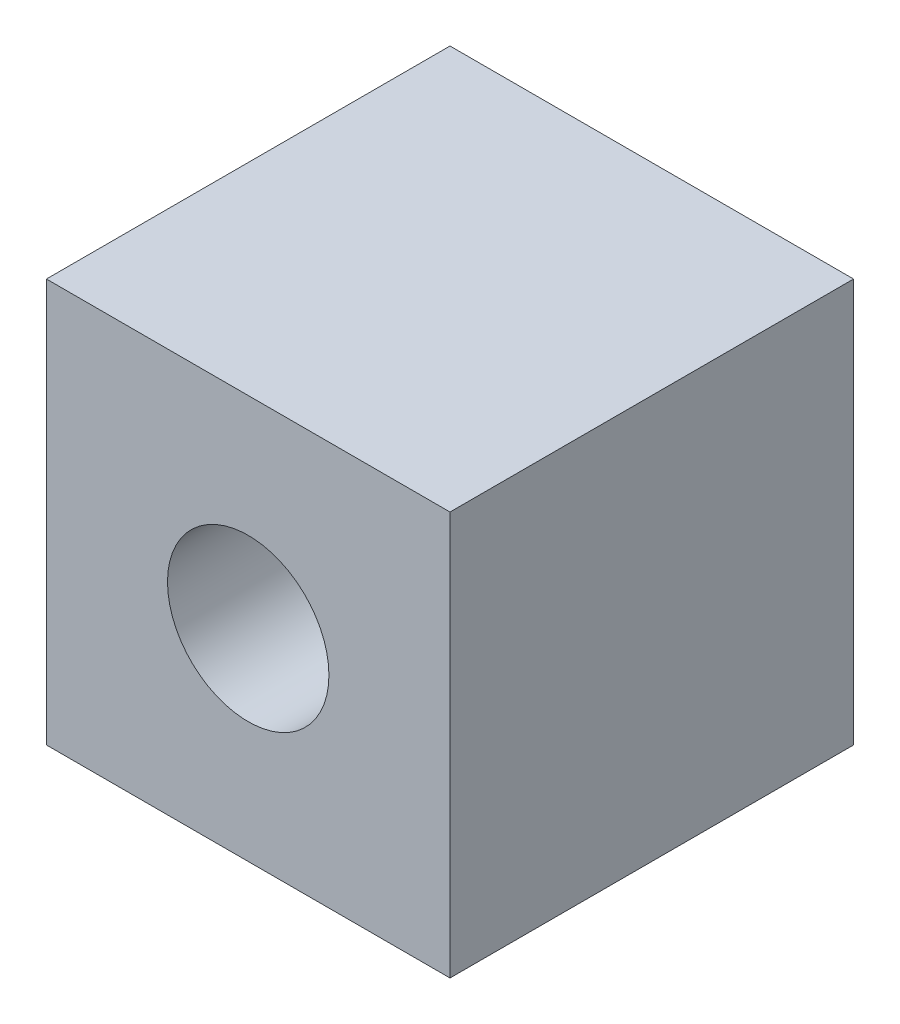
ISO-10303-21;
HEADER;
FILE_DESCRIPTION(('STEP AP214'),'2;1');
FILE_NAME('part.step','',(''),(''),'','','');
FILE_SCHEMA(('AUTOMOTIVE_DESIGN { 1 0 10303 214 1 1 1 1 }'));
ENDSEC;
DATA;
#1=APPLICATION_CONTEXT('core data for automotive mechanical design processes');
#2=APPLICATION_PROTOCOL_DEFINITION('international standard','automotive_design',2000,#1);
#3=PRODUCT_CONTEXT('',#1,'mechanical');
#4=PRODUCT('Part','Part','',(#3));
#5=PRODUCT_RELATED_PRODUCT_CATEGORY('part','',(#4));
#6=PRODUCT_DEFINITION_FORMATION('','',#4);
#7=PRODUCT_DEFINITION_CONTEXT('part definition',#1,'design');
#8=PRODUCT_DEFINITION('design','',#6,#7);
#9=PRODUCT_DEFINITION_SHAPE('','',#8);
#10=(LENGTH_UNIT() NAMED_UNIT(*) SI_UNIT(.MILLI.,.METRE.));
#11=(NAMED_UNIT(*) PLANE_ANGLE_UNIT() SI_UNIT($,.RADIAN.));
#12=(NAMED_UNIT(*) SI_UNIT($,.STERADIAN.) SOLID_ANGLE_UNIT());
#13=UNCERTAINTY_MEASURE_WITH_UNIT(LENGTH_MEASURE(1.E-05),#10,'distance_accuracy_value','');
#14=(GEOMETRIC_REPRESENTATION_CONTEXT(3) GLOBAL_UNCERTAINTY_ASSIGNED_CONTEXT((#13)) GLOBAL_UNIT_ASSIGNED_CONTEXT((#10,
#11,#12)) REPRESENTATION_CONTEXT('',''));
#15=CARTESIAN_POINT('',(0.,0.,0.));
#16=DIRECTION('',(0.,0.,1.));
#17=DIRECTION('',(1.,0.,0.));
#18=AXIS2_PLACEMENT_3D('',#15,#16,#17);
#19=CARTESIAN_POINT('',(0.,0.,10.));
#20=DIRECTION('',(1.,0.,0.));
#21=DIRECTION('',(0.,0.,-1.));
#22=AXIS2_PLACEMENT_3D('',#19,#20,#21);
#23=PLANE('',#22);
#24=DIRECTION('',(0.,-1.,0.));
#25=VECTOR('',#24,1.);
#26=CARTESIAN_POINT('',(0.,0.,0.));
#27=LINE('',#26,#25);
#28=CARTESIAN_POINT('',(0.,10.,0.));
#29=VERTEX_POINT('',#28);
#30=CARTESIAN_POINT('',(0.,0.,0.));
#31=VERTEX_POINT('',#30);
#32=EDGE_CURVE('E98',#29,#31,#27,.T.);
#33=ORIENTED_EDGE('',*,*,#32,.T.);
#34=DIRECTION('',(0.,0.,-1.));
#35=VECTOR('',#34,1.);
#36=CARTESIAN_POINT('',(0.,0.,10.));
#37=LINE('',#36,#35);
#38=CARTESIAN_POINT('',(0.,0.,10.));
#39=VERTEX_POINT('',#38);
#40=EDGE_CURVE('E11',#39,#31,#37,.T.);
#41=ORIENTED_EDGE('',*,*,#40,.F.);
#42=DIRECTION('',(0.,-1.,0.));
#43=VECTOR('',#42,1.);
#44=CARTESIAN_POINT('',(0.,0.,10.));
#45=LINE('',#44,#43);
#46=CARTESIAN_POINT('',(0.,10.,10.));
#47=VERTEX_POINT('',#46);
#48=EDGE_CURVE('E86',#47,#39,#45,.T.);
#49=ORIENTED_EDGE('',*,*,#48,.F.);
#50=DIRECTION('',(0.,0.,-1.));
#51=VECTOR('',#50,1.);
#52=CARTESIAN_POINT('',(0.,10.,10.));
#53=LINE('',#52,#51);
#54=EDGE_CURVE('E94',#47,#29,#53,.T.);
#55=ORIENTED_EDGE('',*,*,#54,.T.);
#56=EDGE_LOOP('',(#33,#41,#49,#55));
#57=FACE_BOUND('',#56,.T.);
#58=ADVANCED_FACE('F35',(#57),#23,.F.);
#59=CARTESIAN_POINT('',(0.,0.,10.));
#60=DIRECTION('',(0.,1.,0.));
#61=DIRECTION('',(0.,0.,1.));
#62=AXIS2_PLACEMENT_3D('',#59,#60,#61);
#63=PLANE('',#62);
#64=DIRECTION('',(1.,0.,0.));
#65=VECTOR('',#64,1.);
#66=CARTESIAN_POINT('',(0.,0.,0.));
#67=LINE('',#66,#65);
#68=CARTESIAN_POINT('',(10.,0.,0.));
#69=VERTEX_POINT('',#68);
#70=EDGE_CURVE('E90',#31,#69,#67,.T.);
#71=ORIENTED_EDGE('',*,*,#70,.T.);
#72=DIRECTION('',(0.,0.,-1.));
#73=VECTOR('',#72,1.);
#74=CARTESIAN_POINT('',(10.,0.,10.));
#75=LINE('',#74,#73);
#76=CARTESIAN_POINT('',(10.,0.,10.));
#77=VERTEX_POINT('',#76);
#78=EDGE_CURVE('E43',#77,#69,#75,.T.);
#79=ORIENTED_EDGE('',*,*,#78,.F.);
#80=DIRECTION('',(1.,0.,0.));
#81=VECTOR('',#80,1.);
#82=CARTESIAN_POINT('',(0.,0.,10.));
#83=LINE('',#82,#81);
#84=EDGE_CURVE('E81',#39,#77,#83,.T.);
#85=ORIENTED_EDGE('',*,*,#84,.F.);
#86=ORIENTED_EDGE('',*,*,#40,.T.);
#87=EDGE_LOOP('',(#71,#79,#85,#86));
#88=FACE_BOUND('',#87,.T.);
#89=ADVANCED_FACE('F89',(#88),#63,.F.);
#90=CARTESIAN_POINT('',(10.,0.,10.));
#91=DIRECTION('',(-1.,0.,0.));
#92=DIRECTION('',(0.,0.,1.));
#93=AXIS2_PLACEMENT_3D('',#90,#91,#92);
#94=PLANE('',#93);
#95=DIRECTION('',(0.,1.,0.));
#96=VECTOR('',#95,1.);
#97=CARTESIAN_POINT('',(10.,0.,0.));
#98=LINE('',#97,#96);
#99=CARTESIAN_POINT('',(10.,10.,0.));
#100=VERTEX_POINT('',#99);
#101=EDGE_CURVE('E68',#69,#100,#98,.T.);
#102=ORIENTED_EDGE('',*,*,#101,.T.);
#103=DIRECTION('',(0.,0.,-1.));
#104=VECTOR('',#103,1.);
#105=CARTESIAN_POINT('',(10.,10.,10.));
#106=LINE('',#105,#104);
#107=CARTESIAN_POINT('',(10.,10.,10.));
#108=VERTEX_POINT('',#107);
#109=EDGE_CURVE('E91',#108,#100,#106,.T.);
#110=ORIENTED_EDGE('',*,*,#109,.F.);
#111=DIRECTION('',(0.,1.,0.));
#112=VECTOR('',#111,1.);
#113=CARTESIAN_POINT('',(10.,0.,10.));
#114=LINE('',#113,#112);
#115=EDGE_CURVE('E84',#77,#108,#114,.T.);
#116=ORIENTED_EDGE('',*,*,#115,.F.);
#117=ORIENTED_EDGE('',*,*,#78,.T.);
#118=EDGE_LOOP('',(#102,#110,#116,#117));
#119=FACE_BOUND('',#118,.T.);
#120=ADVANCED_FACE('F92',(#119),#94,.F.);
#121=CARTESIAN_POINT('',(0.,10.,10.));
#122=DIRECTION('',(0.,-1.,0.));
#123=DIRECTION('',(0.,0.,-1.));
#124=AXIS2_PLACEMENT_3D('',#121,#122,#123);
#125=PLANE('',#124);
#126=DIRECTION('',(-1.,0.,0.));
#127=VECTOR('',#126,1.);
#128=CARTESIAN_POINT('',(0.,10.,0.));
#129=LINE('',#128,#127);
#130=EDGE_CURVE('E74',#100,#29,#129,.T.);
#131=ORIENTED_EDGE('',*,*,#130,.T.);
#132=ORIENTED_EDGE('',*,*,#54,.F.);
#133=DIRECTION('',(-1.,0.,0.));
#134=VECTOR('',#133,1.);
#135=CARTESIAN_POINT('',(0.,10.,10.));
#136=LINE('',#135,#134);
#137=EDGE_CURVE('E51',#108,#47,#136,.T.);
#138=ORIENTED_EDGE('',*,*,#137,.F.);
#139=ORIENTED_EDGE('',*,*,#109,.T.);
#140=EDGE_LOOP('',(#131,#132,#138,#139));
#141=FACE_BOUND('',#140,.T.);
#142=ADVANCED_FACE('F106',(#141),#125,.F.);
#143=CARTESIAN_POINT('',(0.,0.,10.));
#144=DIRECTION('',(0.,0.,-1.));
#145=DIRECTION('',(-1.,0.,0.));
#146=AXIS2_PLACEMENT_3D('',#143,#144,#145);
#147=PLANE('',#146);
#148=CARTESIAN_POINT('',(5.,5.,10.));
#149=DIRECTION('',(0.,0.,1.));
#150=DIRECTION('',(1.,0.,0.));
#151=AXIS2_PLACEMENT_3D('',#148,#149,#150);
#152=CIRCLE('',#151,2.);
#153=CARTESIAN_POINT('',(7.,5.,10.));
#154=VERTEX_POINT('',#153);
#155=EDGE_CURVE('E112',#154,#154,#152,.T.);
#156=ORIENTED_EDGE('',*,*,#155,.F.);
#157=EDGE_LOOP('',(#156));
#158=FACE_BOUND('',#157,.T.);
#159=ORIENTED_EDGE('',*,*,#48,.T.);
#160=ORIENTED_EDGE('',*,*,#84,.T.);
#161=ORIENTED_EDGE('',*,*,#115,.T.);
#162=ORIENTED_EDGE('',*,*,#137,.T.);
#163=EDGE_LOOP('',(#159,#160,#161,#162));
#164=FACE_BOUND('',#163,.T.);
#165=ADVANCED_FACE('F82',(#158,#164),#147,.F.);
#166=CARTESIAN_POINT('',(0.,0.,0.));
#167=DIRECTION('',(0.,0.,-1.));
#168=DIRECTION('',(-1.,0.,0.));
#169=AXIS2_PLACEMENT_3D('',#166,#167,#168);
#170=PLANE('',#169);
#171=CARTESIAN_POINT('',(5.,5.,0.));
#172=DIRECTION('',(0.,0.,1.));
#173=DIRECTION('',(1.,0.,0.));
#174=AXIS2_PLACEMENT_3D('',#171,#172,#173);
#175=CIRCLE('',#174,2.);
#176=CARTESIAN_POINT('',(7.,5.,0.));
#177=VERTEX_POINT('',#176);
#178=EDGE_CURVE('E101',#177,#177,#175,.T.);
#179=ORIENTED_EDGE('',*,*,#178,.T.);
#180=EDGE_LOOP('',(#179));
#181=FACE_BOUND('',#180,.T.);
#182=ORIENTED_EDGE('',*,*,#32,.F.);
#183=ORIENTED_EDGE('',*,*,#130,.F.);
#184=ORIENTED_EDGE('',*,*,#101,.F.);
#185=ORIENTED_EDGE('',*,*,#70,.F.);
#186=EDGE_LOOP('',(#182,#183,#184,#185));
#187=FACE_BOUND('',#186,.T.);
#188=ADVANCED_FACE('F109',(#181,#187),#170,.T.);
#189=CARTESIAN_POINT('',(5.,5.,0.));
#190=DIRECTION('',(0.,0.,1.));
#191=DIRECTION('',(1.,0.,0.));
#192=AXIS2_PLACEMENT_3D('',#189,#190,#191);
#193=CYLINDRICAL_SURFACE('',#192,2.);
#194=ORIENTED_EDGE('',*,*,#178,.F.);
#195=EDGE_LOOP('',(#194));
#196=FACE_BOUND('',#195,.T.);
#197=ORIENTED_EDGE('',*,*,#155,.T.);
#198=EDGE_LOOP('',(#197));
#199=FACE_BOUND('',#198,.T.);
#200=ADVANCED_FACE('F119',(#196,#199),#193,.F.);
#201=CLOSED_SHELL('',(#58,#89,#120,#142,#165,#188,#200));
#202=MANIFOLD_SOLID_BREP('B2',#201);
#203=ADVANCED_BREP_SHAPE_REPRESENTATION('',(#18,#202),#14);
#204=SHAPE_DEFINITION_REPRESENTATION(#9,#203);
ENDSEC;
END-ISO-10303-21;
